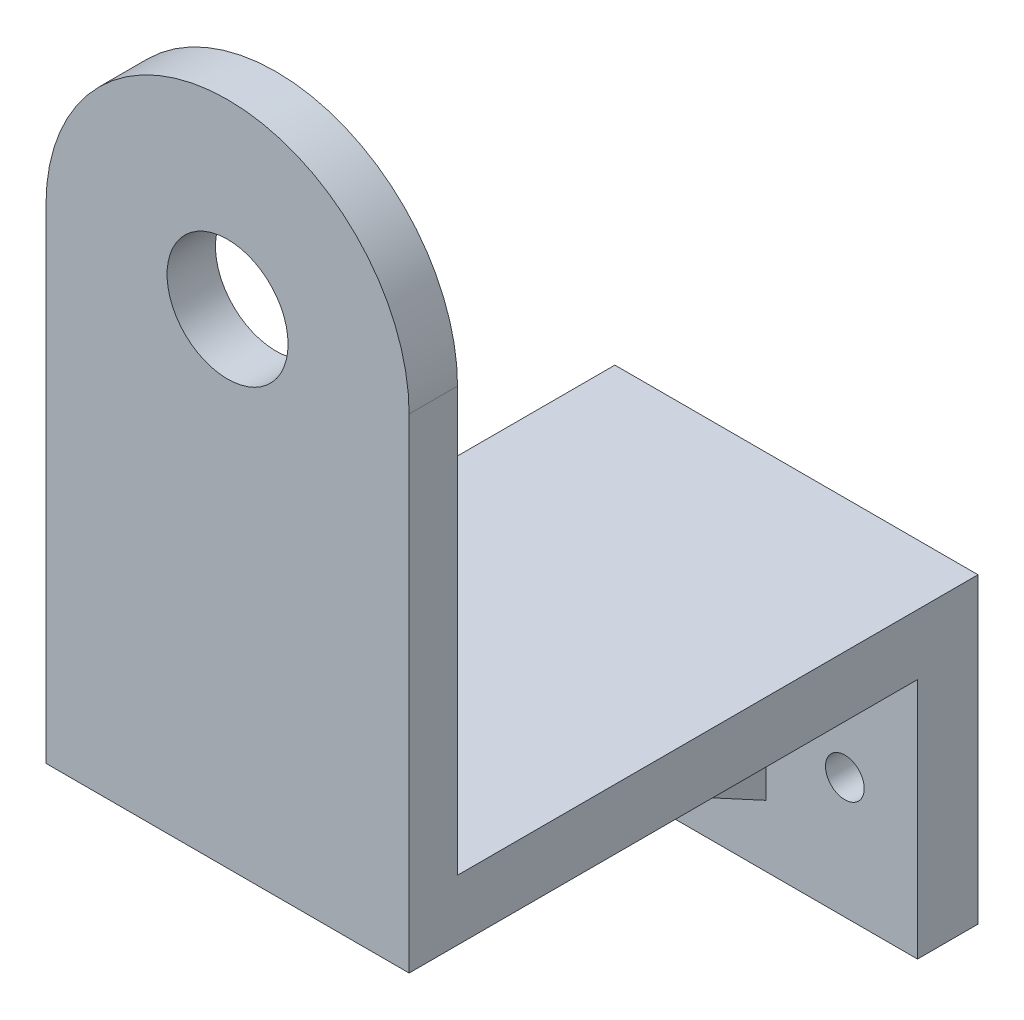
ISO-10303-21;
HEADER;
FILE_DESCRIPTION(('STEP AP214'),'2;1');
FILE_NAME('part.step','',(''),(''),'','','');
FILE_SCHEMA(('AUTOMOTIVE_DESIGN { 1 0 10303 214 1 1 1 1 }'));
ENDSEC;
DATA;
#1=APPLICATION_CONTEXT('core data for automotive mechanical design processes');
#2=APPLICATION_PROTOCOL_DEFINITION('international standard','automotive_design',2000,#1);
#3=PRODUCT_CONTEXT('',#1,'mechanical');
#4=PRODUCT('Part','Part','',(#3));
#5=PRODUCT_RELATED_PRODUCT_CATEGORY('part','',(#4));
#6=PRODUCT_DEFINITION_FORMATION('','',#4);
#7=PRODUCT_DEFINITION_CONTEXT('part definition',#1,'design');
#8=PRODUCT_DEFINITION('design','',#6,#7);
#9=PRODUCT_DEFINITION_SHAPE('','',#8);
#10=(LENGTH_UNIT() NAMED_UNIT(*) SI_UNIT(.MILLI.,.METRE.));
#11=(NAMED_UNIT(*) PLANE_ANGLE_UNIT() SI_UNIT($,.RADIAN.));
#12=(NAMED_UNIT(*) SI_UNIT($,.STERADIAN.) SOLID_ANGLE_UNIT());
#13=UNCERTAINTY_MEASURE_WITH_UNIT(LENGTH_MEASURE(1.E-05),#10,'distance_accuracy_value','');
#14=(GEOMETRIC_REPRESENTATION_CONTEXT(3) GLOBAL_UNCERTAINTY_ASSIGNED_CONTEXT((#13)) GLOBAL_UNIT_ASSIGNED_CONTEXT((#10,
#11,#12)) REPRESENTATION_CONTEXT('',''));
#15=CARTESIAN_POINT('',(0.,0.,0.));
#16=DIRECTION('',(0.,0.,1.));
#17=DIRECTION('',(1.,0.,0.));
#18=AXIS2_PLACEMENT_3D('',#15,#16,#17);
#19=CARTESIAN_POINT('',(0.,0.,4.));
#20=DIRECTION('',(0.,0.,1.));
#21=DIRECTION('',(1.,0.,0.));
#22=AXIS2_PLACEMENT_3D('',#19,#20,#21);
#23=PLANE('',#22);
#24=CARTESIAN_POINT('',(0.,0.,4.));
#25=DIRECTION('',(0.,0.,1.));
#26=DIRECTION('',(1.,0.,0.));
#27=AXIS2_PLACEMENT_3D('',#24,#25,#26);
#28=CIRCLE('',#27,5.);
#29=CARTESIAN_POINT('',(5.,0.,4.));
#30=VERTEX_POINT('',#29);
#31=EDGE_CURVE('E219',#30,#30,#28,.T.);
#32=ORIENTED_EDGE('',*,*,#31,.F.);
#33=EDGE_LOOP('',(#32));
#34=FACE_BOUND('',#33,.T.);
#35=CARTESIAN_POINT('',(0.,0.,4.));
#36=DIRECTION('',(0.,0.,1.));
#37=DIRECTION('',(1.,0.,0.));
#38=AXIS2_PLACEMENT_3D('',#35,#36,#37);
#39=CIRCLE('',#38,15.);
#40=CARTESIAN_POINT('',(15.,0.,4.));
#41=VERTEX_POINT('',#40);
#42=CARTESIAN_POINT('',(-15.,0.,4.));
#43=VERTEX_POINT('',#42);
#44=EDGE_CURVE('E227',#41,#43,#39,.T.);
#45=ORIENTED_EDGE('',*,*,#44,.T.);
#46=DIRECTION('',(0.,-1.,0.));
#47=VECTOR('',#46,1.);
#48=CARTESIAN_POINT('',(-15.,-40.,4.));
#49=LINE('',#48,#47);
#50=CARTESIAN_POINT('',(-15.,-40.,4.));
#51=VERTEX_POINT('',#50);
#52=EDGE_CURVE('E230',#43,#51,#49,.T.);
#53=ORIENTED_EDGE('',*,*,#52,.T.);
#54=DIRECTION('',(1.,0.,0.));
#55=VECTOR('',#54,1.);
#56=CARTESIAN_POINT('',(15.,-40.,4.));
#57=LINE('',#56,#55);
#58=CARTESIAN_POINT('',(15.,-40.,4.));
#59=VERTEX_POINT('',#58);
#60=EDGE_CURVE('E234',#51,#59,#57,.T.);
#61=ORIENTED_EDGE('',*,*,#60,.T.);
#62=DIRECTION('',(0.,1.,0.));
#63=VECTOR('',#62,1.);
#64=CARTESIAN_POINT('',(15.,0.,4.));
#65=LINE('',#64,#63);
#66=EDGE_CURVE('E237',#59,#41,#65,.T.);
#67=ORIENTED_EDGE('',*,*,#66,.T.);
#68=EDGE_LOOP('',(#45,#53,#61,#67));
#69=FACE_BOUND('',#68,.T.);
#70=ADVANCED_FACE('F42',(#34,#69),#23,.T.);
#71=CARTESIAN_POINT('',(0.,0.,0.));
#72=DIRECTION('',(0.,0.,1.));
#73=DIRECTION('',(1.,0.,0.));
#74=AXIS2_PLACEMENT_3D('',#71,#72,#73);
#75=PLANE('',#74);
#76=CARTESIAN_POINT('',(0.,0.,0.));
#77=DIRECTION('',(0.,0.,1.));
#78=DIRECTION('',(1.,0.,0.));
#79=AXIS2_PLACEMENT_3D('',#76,#77,#78);
#80=CIRCLE('',#79,5.);
#81=CARTESIAN_POINT('',(5.,0.,0.));
#82=VERTEX_POINT('',#81);
#83=EDGE_CURVE('E216',#82,#82,#80,.T.);
#84=ORIENTED_EDGE('',*,*,#83,.T.);
#85=EDGE_LOOP('',(#84));
#86=FACE_BOUND('',#85,.T.);
#87=DIRECTION('',(0.,-1.,0.));
#88=VECTOR('',#87,1.);
#89=CARTESIAN_POINT('',(-15.,-40.,0.));
#90=LINE('',#89,#88);
#91=CARTESIAN_POINT('',(-15.,0.,0.));
#92=VERTEX_POINT('',#91);
#93=CARTESIAN_POINT('',(-15.,-35.,0.));
#94=VERTEX_POINT('',#93);
#95=EDGE_CURVE('E243',#92,#94,#90,.T.);
#96=ORIENTED_EDGE('',*,*,#95,.F.);
#97=CARTESIAN_POINT('',(0.,0.,0.));
#98=DIRECTION('',(0.,0.,1.));
#99=DIRECTION('',(1.,0.,0.));
#100=AXIS2_PLACEMENT_3D('',#97,#98,#99);
#101=CIRCLE('',#100,15.);
#102=CARTESIAN_POINT('',(15.,0.,0.));
#103=VERTEX_POINT('',#102);
#104=EDGE_CURVE('E223',#103,#92,#101,.T.);
#105=ORIENTED_EDGE('',*,*,#104,.F.);
#106=DIRECTION('',(0.,1.,0.));
#107=VECTOR('',#106,1.);
#108=CARTESIAN_POINT('',(15.,0.,0.));
#109=LINE('',#108,#107);
#110=CARTESIAN_POINT('',(15.,-35.,0.));
#111=VERTEX_POINT('',#110);
#112=EDGE_CURVE('E231',#111,#103,#109,.T.);
#113=ORIENTED_EDGE('',*,*,#112,.F.);
#114=DIRECTION('',(-1.,0.,0.));
#115=VECTOR('',#114,1.);
#116=CARTESIAN_POINT('',(-15.,-35.,0.));
#117=LINE('',#116,#115);
#118=EDGE_CURVE('E213',#111,#94,#117,.T.);
#119=ORIENTED_EDGE('',*,*,#118,.T.);
#120=EDGE_LOOP('',(#96,#105,#113,#119));
#121=FACE_BOUND('',#120,.T.);
#122=ADVANCED_FACE('F298',(#86,#121),#75,.F.);
#123=CARTESIAN_POINT('',(0.,0.,4.));
#124=DIRECTION('',(0.,0.,-1.));
#125=DIRECTION('',(-1.,0.,0.));
#126=AXIS2_PLACEMENT_3D('',#123,#124,#125);
#127=CYLINDRICAL_SURFACE('',#126,15.);
#128=ORIENTED_EDGE('',*,*,#104,.T.);
#129=DIRECTION('',(0.,0.,-1.));
#130=VECTOR('',#129,1.);
#131=CARTESIAN_POINT('',(-15.,0.,4.));
#132=LINE('',#131,#130);
#133=EDGE_CURVE('E11',#43,#92,#132,.T.);
#134=ORIENTED_EDGE('',*,*,#133,.F.);
#135=ORIENTED_EDGE('',*,*,#44,.F.);
#136=DIRECTION('',(0.,0.,-1.));
#137=VECTOR('',#136,1.);
#138=CARTESIAN_POINT('',(15.,0.,4.));
#139=LINE('',#138,#137);
#140=EDGE_CURVE('E240',#41,#103,#139,.T.);
#141=ORIENTED_EDGE('',*,*,#140,.T.);
#142=EDGE_LOOP('',(#128,#134,#135,#141));
#143=FACE_BOUND('',#142,.T.);
#144=ADVANCED_FACE('F44',(#143),#127,.T.);
#145=CARTESIAN_POINT('',(-15.,-40.,4.));
#146=DIRECTION('',(1.,0.,0.));
#147=DIRECTION('',(0.,1.,0.));
#148=AXIS2_PLACEMENT_3D('',#145,#146,#147);
#149=PLANE('',#148);
#150=ORIENTED_EDGE('',*,*,#95,.T.);
#151=DIRECTION('',(0.,0.,-1.));
#152=VECTOR('',#151,1.);
#153=CARTESIAN_POINT('',(-15.,-35.,0.));
#154=LINE('',#153,#152);
#155=CARTESIAN_POINT('',(-15.,-35.,-43.));
#156=VERTEX_POINT('',#155);
#157=EDGE_CURVE('E66',#94,#156,#154,.T.);
#158=ORIENTED_EDGE('',*,*,#157,.T.);
#159=DIRECTION('',(0.,1.,0.));
#160=VECTOR('',#159,1.);
#161=CARTESIAN_POINT('',(-15.,-35.,-43.));
#162=LINE('',#161,#160);
#163=CARTESIAN_POINT('',(-15.,-60.,-43.));
#164=VERTEX_POINT('',#163);
#165=EDGE_CURVE('E186',#164,#156,#162,.T.);
#166=ORIENTED_EDGE('',*,*,#165,.F.);
#167=DIRECTION('',(0.,0.,1.));
#168=VECTOR('',#167,1.);
#169=CARTESIAN_POINT('',(-15.,-60.,-43.));
#170=LINE('',#169,#168);
#171=CARTESIAN_POINT('',(-15.,-60.,-38.));
#172=VERTEX_POINT('',#171);
#173=EDGE_CURVE('E190',#164,#172,#170,.T.);
#174=ORIENTED_EDGE('',*,*,#173,.T.);
#175=DIRECTION('',(0.,1.,0.));
#176=VECTOR('',#175,1.);
#177=CARTESIAN_POINT('',(-15.,-35.,-38.));
#178=LINE('',#177,#176);
#179=CARTESIAN_POINT('',(-15.,-40.,-38.));
#180=VERTEX_POINT('',#179);
#181=EDGE_CURVE('E180',#172,#180,#178,.T.);
#182=ORIENTED_EDGE('',*,*,#181,.T.);
#183=DIRECTION('',(0.,0.,-1.));
#184=VECTOR('',#183,1.);
#185=CARTESIAN_POINT('',(-15.,-40.,4.));
#186=LINE('',#185,#184);
#187=EDGE_CURVE('E51',#51,#180,#186,.T.);
#188=ORIENTED_EDGE('',*,*,#187,.F.);
#189=ORIENTED_EDGE('',*,*,#52,.F.);
#190=ORIENTED_EDGE('',*,*,#133,.T.);
#191=EDGE_LOOP('',(#150,#158,#166,#174,#182,#188,#189,#190));
#192=FACE_BOUND('',#191,.T.);
#193=ADVANCED_FACE('F264',(#192),#149,.F.);
#194=CARTESIAN_POINT('',(15.,-40.,4.));
#195=DIRECTION('',(0.,1.,0.));
#196=DIRECTION('',(0.,0.,1.));
#197=AXIS2_PLACEMENT_3D('',#194,#195,#196);
#198=PLANE('',#197);
#199=DIRECTION('',(-1.,0.,0.));
#200=VECTOR('',#199,1.);
#201=CARTESIAN_POINT('',(15.,-40.,-10.4067418440572));
#202=LINE('',#201,#200);
#203=CARTESIAN_POINT('',(-2.5,-40.,-10.4067418440572));
#204=VERTEX_POINT('',#203);
#205=CARTESIAN_POINT('',(2.5,-40.,-10.4067418440572));
#206=VERTEX_POINT('',#205);
#207=EDGE_CURVE('E141',#204,#206,#202,.F.);
#208=ORIENTED_EDGE('',*,*,#207,.T.);
#209=DIRECTION('',(0.,0.,-1.));
#210=VECTOR('',#209,1.);
#211=CARTESIAN_POINT('',(2.5,-40.,4.));
#212=LINE('',#211,#210);
#213=CARTESIAN_POINT('',(2.5,-40.,-38.));
#214=VERTEX_POINT('',#213);
#215=EDGE_CURVE('E150',#206,#214,#212,.T.);
#216=ORIENTED_EDGE('',*,*,#215,.T.);
#217=DIRECTION('',(1.,0.,0.));
#218=VECTOR('',#217,1.);
#219=CARTESIAN_POINT('',(-15.,-40.,-38.));
#220=LINE('',#219,#218);
#221=CARTESIAN_POINT('',(15.,-40.,-38.));
#222=VERTEX_POINT('',#221);
#223=EDGE_CURVE('E206',#214,#222,#220,.T.);
#224=ORIENTED_EDGE('',*,*,#223,.T.);
#225=DIRECTION('',(0.,0.,-1.));
#226=VECTOR('',#225,1.);
#227=CARTESIAN_POINT('',(15.,-40.,4.));
#228=LINE('',#227,#226);
#229=EDGE_CURVE('E252',#59,#222,#228,.T.);
#230=ORIENTED_EDGE('',*,*,#229,.F.);
#231=ORIENTED_EDGE('',*,*,#60,.F.);
#232=ORIENTED_EDGE('',*,*,#187,.T.);
#233=CARTESIAN_POINT('',(-2.5,-40.,-38.));
#234=VERTEX_POINT('',#233);
#235=EDGE_CURVE('E210',#180,#234,#220,.T.);
#236=ORIENTED_EDGE('',*,*,#235,.T.);
#237=DIRECTION('',(0.,0.,-1.));
#238=VECTOR('',#237,1.);
#239=CARTESIAN_POINT('',(-2.5,-40.,4.));
#240=LINE('',#239,#238);
#241=EDGE_CURVE('E58',#204,#234,#240,.T.);
#242=ORIENTED_EDGE('',*,*,#241,.F.);
#243=EDGE_LOOP('',(#208,#216,#224,#230,#231,#232,#236,#242));
#244=FACE_BOUND('',#243,.T.);
#245=ADVANCED_FACE('F260',(#244),#198,.F.);
#246=CARTESIAN_POINT('',(15.,0.,4.));
#247=DIRECTION('',(-1.,0.,0.));
#248=DIRECTION('',(0.,-1.,0.));
#249=AXIS2_PLACEMENT_3D('',#246,#247,#248);
#250=PLANE('',#249);
#251=ORIENTED_EDGE('',*,*,#229,.T.);
#252=DIRECTION('',(0.,-1.,0.));
#253=VECTOR('',#252,1.);
#254=CARTESIAN_POINT('',(15.,-35.,-38.));
#255=LINE('',#254,#253);
#256=CARTESIAN_POINT('',(15.,-60.,-38.));
#257=VERTEX_POINT('',#256);
#258=EDGE_CURVE('E172',#222,#257,#255,.T.);
#259=ORIENTED_EDGE('',*,*,#258,.T.);
#260=DIRECTION('',(0.,0.,1.));
#261=VECTOR('',#260,1.);
#262=CARTESIAN_POINT('',(15.,-60.,-43.));
#263=LINE('',#262,#261);
#264=CARTESIAN_POINT('',(15.,-60.,-43.));
#265=VERTEX_POINT('',#264);
#266=EDGE_CURVE('E202',#265,#257,#263,.T.);
#267=ORIENTED_EDGE('',*,*,#266,.F.);
#268=DIRECTION('',(0.,-1.,0.));
#269=VECTOR('',#268,1.);
#270=CARTESIAN_POINT('',(15.,-35.,-43.));
#271=LINE('',#270,#269);
#272=CARTESIAN_POINT('',(15.,-35.,-43.));
#273=VERTEX_POINT('',#272);
#274=EDGE_CURVE('E179',#273,#265,#271,.T.);
#275=ORIENTED_EDGE('',*,*,#274,.F.);
#276=DIRECTION('',(0.,0.,1.));
#277=VECTOR('',#276,1.);
#278=CARTESIAN_POINT('',(15.,-35.,0.));
#279=LINE('',#278,#277);
#280=EDGE_CURVE('E209',#273,#111,#279,.T.);
#281=ORIENTED_EDGE('',*,*,#280,.T.);
#282=ORIENTED_EDGE('',*,*,#112,.T.);
#283=ORIENTED_EDGE('',*,*,#140,.F.);
#284=ORIENTED_EDGE('',*,*,#66,.F.);
#285=EDGE_LOOP('',(#251,#259,#267,#275,#281,#282,#283,#284));
#286=FACE_BOUND('',#285,.T.);
#287=ADVANCED_FACE('F277',(#286),#250,.F.);
#288=CARTESIAN_POINT('',(0.,0.,4.));
#289=DIRECTION('',(0.,0.,-1.));
#290=DIRECTION('',(-1.,0.,0.));
#291=AXIS2_PLACEMENT_3D('',#288,#289,#290);
#292=CYLINDRICAL_SURFACE('',#291,5.);
#293=ORIENTED_EDGE('',*,*,#83,.F.);
#294=EDGE_LOOP('',(#293));
#295=FACE_BOUND('',#294,.T.);
#296=ORIENTED_EDGE('',*,*,#31,.T.);
#297=EDGE_LOOP('',(#296));
#298=FACE_BOUND('',#297,.T.);
#299=ADVANCED_FACE('F309',(#295,#298),#292,.F.);
#300=CARTESIAN_POINT('',(0.,-35.,0.));
#301=DIRECTION('',(0.,-1.,0.));
#302=DIRECTION('',(0.,0.,-1.));
#303=AXIS2_PLACEMENT_3D('',#300,#301,#302);
#304=PLANE('',#303);
#305=ORIENTED_EDGE('',*,*,#280,.F.);
#306=DIRECTION('',(1.,0.,0.));
#307=VECTOR('',#306,1.);
#308=CARTESIAN_POINT('',(15.,-35.,-43.));
#309=LINE('',#308,#307);
#310=EDGE_CURVE('E176',#156,#273,#309,.T.);
#311=ORIENTED_EDGE('',*,*,#310,.F.);
#312=ORIENTED_EDGE('',*,*,#157,.F.);
#313=ORIENTED_EDGE('',*,*,#118,.F.);
#314=EDGE_LOOP('',(#305,#311,#312,#313));
#315=FACE_BOUND('',#314,.T.);
#316=ADVANCED_FACE('F331',(#315),#304,.F.);
#317=CARTESIAN_POINT('',(0.,0.,-38.));
#318=DIRECTION('',(0.,0.,1.));
#319=DIRECTION('',(1.,0.,0.));
#320=AXIS2_PLACEMENT_3D('',#317,#318,#319);
#321=PLANE('',#320);
#322=DIRECTION('',(0.,1.,0.));
#323=VECTOR('',#322,1.);
#324=CARTESIAN_POINT('',(2.5,0.,-38.));
#325=LINE('',#324,#323);
#326=CARTESIAN_POINT('',(2.5,-54.8920054121069,-38.));
#327=VERTEX_POINT('',#326);
#328=EDGE_CURVE('E148',#327,#214,#325,.T.);
#329=ORIENTED_EDGE('',*,*,#328,.F.);
#330=DIRECTION('',(-1.,0.,0.));
#331=VECTOR('',#330,1.);
#332=CARTESIAN_POINT('',(0.,-54.8920054121069,-38.));
#333=LINE('',#332,#331);
#334=CARTESIAN_POINT('',(-2.5,-54.8920054121069,-38.));
#335=VERTEX_POINT('',#334);
#336=EDGE_CURVE('E138',#335,#327,#333,.F.);
#337=ORIENTED_EDGE('',*,*,#336,.F.);
#338=DIRECTION('',(0.,1.,0.));
#339=VECTOR('',#338,1.);
#340=CARTESIAN_POINT('',(-2.5,0.,-38.));
#341=LINE('',#340,#339);
#342=EDGE_CURVE('E125',#335,#234,#341,.T.);
#343=ORIENTED_EDGE('',*,*,#342,.T.);
#344=ORIENTED_EDGE('',*,*,#235,.F.);
#345=ORIENTED_EDGE('',*,*,#181,.F.);
#346=DIRECTION('',(-1.,0.,0.));
#347=VECTOR('',#346,1.);
#348=CARTESIAN_POINT('',(15.,-60.,-38.));
#349=LINE('',#348,#347);
#350=EDGE_CURVE('E193',#257,#172,#349,.T.);
#351=ORIENTED_EDGE('',*,*,#350,.F.);
#352=ORIENTED_EDGE('',*,*,#258,.F.);
#353=ORIENTED_EDGE('',*,*,#223,.F.);
#354=EDGE_LOOP('',(#329,#337,#343,#344,#345,#351,#352,#353));
#355=FACE_BOUND('',#354,.T.);
#356=CARTESIAN_POINT('',(9.00000000000001,-50.,-38.));
#357=DIRECTION('',(0.,0.,-1.));
#358=DIRECTION('',(-1.,0.,0.));
#359=AXIS2_PLACEMENT_3D('',#356,#357,#358);
#360=CIRCLE('',#359,1.60000000000001);
#361=CARTESIAN_POINT('',(7.4,-50.,-38.));
#362=VERTEX_POINT('',#361);
#363=EDGE_CURVE('E154',#362,#362,#360,.T.);
#364=ORIENTED_EDGE('',*,*,#363,.T.);
#365=EDGE_LOOP('',(#364));
#366=FACE_BOUND('',#365,.T.);
#367=CARTESIAN_POINT('',(-8.99999999999999,-50.,-38.));
#368=DIRECTION('',(0.,0.,-1.));
#369=DIRECTION('',(-1.,0.,0.));
#370=AXIS2_PLACEMENT_3D('',#367,#368,#369);
#371=CIRCLE('',#370,1.6);
#372=CARTESIAN_POINT('',(-10.6,-50.,-38.));
#373=VERTEX_POINT('',#372);
#374=EDGE_CURVE('E164',#373,#373,#371,.T.);
#375=ORIENTED_EDGE('',*,*,#374,.T.);
#376=EDGE_LOOP('',(#375));
#377=FACE_BOUND('',#376,.T.);
#378=ADVANCED_FACE('F145',(#355,#366,#377),#321,.T.);
#379=CARTESIAN_POINT('',(0.,0.,-43.));
#380=DIRECTION('',(0.,0.,1.));
#381=DIRECTION('',(1.,0.,0.));
#382=AXIS2_PLACEMENT_3D('',#379,#380,#381);
#383=PLANE('',#382);
#384=ORIENTED_EDGE('',*,*,#310,.T.);
#385=ORIENTED_EDGE('',*,*,#274,.T.);
#386=DIRECTION('',(-1.,0.,0.));
#387=VECTOR('',#386,1.);
#388=CARTESIAN_POINT('',(15.,-60.,-43.));
#389=LINE('',#388,#387);
#390=EDGE_CURVE('E183',#265,#164,#389,.T.);
#391=ORIENTED_EDGE('',*,*,#390,.T.);
#392=ORIENTED_EDGE('',*,*,#165,.T.);
#393=EDGE_LOOP('',(#384,#385,#391,#392));
#394=FACE_BOUND('',#393,.T.);
#395=CARTESIAN_POINT('',(-8.99999999999999,-50.,-43.));
#396=DIRECTION('',(0.,0.,-1.));
#397=DIRECTION('',(-1.,0.,0.));
#398=AXIS2_PLACEMENT_3D('',#395,#396,#397);
#399=CIRCLE('',#398,1.6);
#400=CARTESIAN_POINT('',(-10.6,-50.,-43.));
#401=VERTEX_POINT('',#400);
#402=EDGE_CURVE('E168',#401,#401,#399,.T.);
#403=ORIENTED_EDGE('',*,*,#402,.F.);
#404=EDGE_LOOP('',(#403));
#405=FACE_BOUND('',#404,.T.);
#406=CARTESIAN_POINT('',(9.00000000000001,-50.,-43.));
#407=DIRECTION('',(0.,0.,-1.));
#408=DIRECTION('',(-1.,0.,0.));
#409=AXIS2_PLACEMENT_3D('',#406,#407,#408);
#410=CIRCLE('',#409,1.60000000000001);
#411=CARTESIAN_POINT('',(7.4,-50.,-43.));
#412=VERTEX_POINT('',#411);
#413=EDGE_CURVE('E160',#412,#412,#410,.T.);
#414=ORIENTED_EDGE('',*,*,#413,.F.);
#415=EDGE_LOOP('',(#414));
#416=FACE_BOUND('',#415,.T.);
#417=ADVANCED_FACE('F328',(#394,#405,#416),#383,.F.);
#418=CARTESIAN_POINT('',(15.,-60.,-43.));
#419=DIRECTION('',(0.,1.,0.));
#420=DIRECTION('',(0.,0.,1.));
#421=AXIS2_PLACEMENT_3D('',#418,#419,#420);
#422=PLANE('',#421);
#423=ORIENTED_EDGE('',*,*,#350,.T.);
#424=ORIENTED_EDGE('',*,*,#173,.F.);
#425=ORIENTED_EDGE('',*,*,#390,.F.);
#426=ORIENTED_EDGE('',*,*,#266,.T.);
#427=EDGE_LOOP('',(#423,#424,#425,#426));
#428=FACE_BOUND('',#427,.T.);
#429=ADVANCED_FACE('F272',(#428),#422,.F.);
#430=CARTESIAN_POINT('',(-8.99999999999999,-50.,-43.));
#431=DIRECTION('',(0.,0.,1.));
#432=DIRECTION('',(1.,0.,0.));
#433=AXIS2_PLACEMENT_3D('',#430,#431,#432);
#434=CYLINDRICAL_SURFACE('',#433,1.6);
#435=ORIENTED_EDGE('',*,*,#402,.T.);
#436=EDGE_LOOP('',(#435));
#437=FACE_BOUND('',#436,.T.);
#438=ORIENTED_EDGE('',*,*,#374,.F.);
#439=EDGE_LOOP('',(#438));
#440=FACE_BOUND('',#439,.T.);
#441=ADVANCED_FACE('F341',(#437,#440),#434,.F.);
#442=CARTESIAN_POINT('',(9.00000000000001,-50.,-43.));
#443=DIRECTION('',(0.,0.,1.));
#444=DIRECTION('',(1.,0.,0.));
#445=AXIS2_PLACEMENT_3D('',#442,#443,#444);
#446=CYLINDRICAL_SURFACE('',#445,1.60000000000001);
#447=ORIENTED_EDGE('',*,*,#413,.T.);
#448=EDGE_LOOP('',(#447));
#449=FACE_BOUND('',#448,.T.);
#450=ORIENTED_EDGE('',*,*,#363,.F.);
#451=EDGE_LOOP('',(#450));
#452=FACE_BOUND('',#451,.T.);
#453=ADVANCED_FACE('F295',(#449,#452),#446,.F.);
#454=CARTESIAN_POINT('',(0.,-54.8920054121069,-38.));
#455=DIRECTION('',(0.,0.880016763873254,-0.474942623168363));
#456=DIRECTION('',(0.,0.474942623168363,0.880016763873254));
#457=AXIS2_PLACEMENT_3D('',#454,#455,#456);
#458=PLANE('',#457);
#459=ORIENTED_EDGE('',*,*,#207,.F.);
#460=DIRECTION('',(0.,0.474942623168363,0.880016763873254));
#461=VECTOR('',#460,1.);
#462=CARTESIAN_POINT('',(-2.5,-54.8920054121069,-38.));
#463=LINE('',#462,#461);
#464=EDGE_CURVE('E128',#335,#204,#463,.T.);
#465=ORIENTED_EDGE('',*,*,#464,.F.);
#466=ORIENTED_EDGE('',*,*,#336,.T.);
#467=DIRECTION('',(0.,0.474942623168363,0.880016763873254));
#468=VECTOR('',#467,1.);
#469=CARTESIAN_POINT('',(2.5,-54.8920054121069,-38.));
#470=LINE('',#469,#468);
#471=EDGE_CURVE('E133',#327,#206,#470,.T.);
#472=ORIENTED_EDGE('',*,*,#471,.T.);
#473=EDGE_LOOP('',(#459,#465,#466,#472));
#474=FACE_BOUND('',#473,.T.);
#475=ADVANCED_FACE('F136',(#474),#458,.F.);
#476=CARTESIAN_POINT('',(2.5,-22.5,-19.5));
#477=DIRECTION('',(1.,0.,0.));
#478=DIRECTION('',(0.,0.,-1.));
#479=AXIS2_PLACEMENT_3D('',#476,#477,#478);
#480=PLANE('',#479);
#481=ORIENTED_EDGE('',*,*,#215,.F.);
#482=ORIENTED_EDGE('',*,*,#471,.F.);
#483=ORIENTED_EDGE('',*,*,#328,.T.);
#484=EDGE_LOOP('',(#481,#482,#483));
#485=FACE_BOUND('',#484,.T.);
#486=ADVANCED_FACE('F282',(#485),#480,.T.);
#487=CARTESIAN_POINT('',(-2.5,-22.5,-19.5));
#488=DIRECTION('',(1.,0.,0.));
#489=DIRECTION('',(0.,0.,-1.));
#490=AXIS2_PLACEMENT_3D('',#487,#488,#489);
#491=PLANE('',#490);
#492=ORIENTED_EDGE('',*,*,#464,.T.);
#493=ORIENTED_EDGE('',*,*,#241,.T.);
#494=ORIENTED_EDGE('',*,*,#342,.F.);
#495=EDGE_LOOP('',(#492,#493,#494));
#496=FACE_BOUND('',#495,.T.);
#497=ADVANCED_FACE('F127',(#496),#491,.F.);
#498=CLOSED_SHELL('',(#70,#122,#144,#193,#245,#287,#299,#316,#378,#417,#429,#441,#453,#475,#486,#497));
#499=MANIFOLD_SOLID_BREP('B2',#498);
#500=ADVANCED_BREP_SHAPE_REPRESENTATION('',(#18,#499),#14);
#501=SHAPE_DEFINITION_REPRESENTATION(#9,#500);
ENDSEC;
END-ISO-10303-21;
